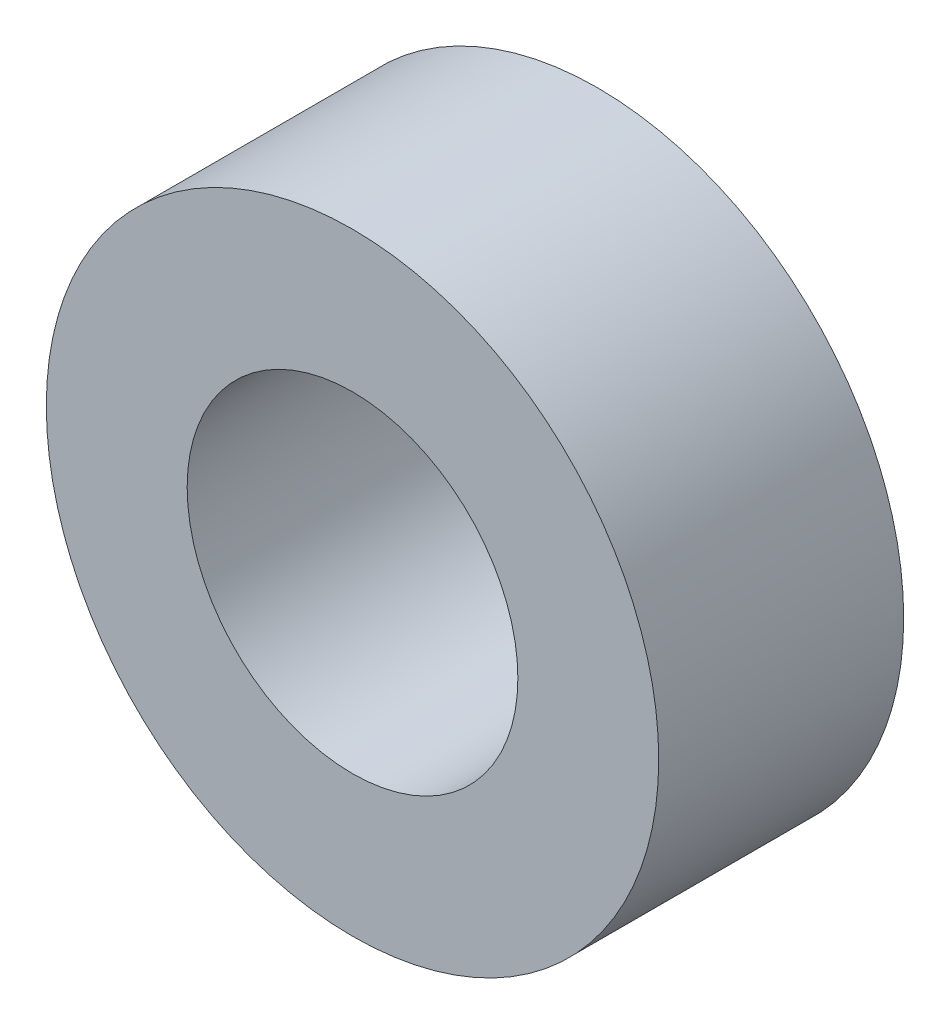
ISO-10303-21;
HEADER;
FILE_DESCRIPTION(('STEP AP214'),'2;1');
FILE_NAME('part.step','',(''),(''),'','','');
FILE_SCHEMA(('AUTOMOTIVE_DESIGN { 1 0 10303 214 1 1 1 1 }'));
ENDSEC;
DATA;
#1=APPLICATION_CONTEXT('core data for automotive mechanical design processes');
#2=APPLICATION_PROTOCOL_DEFINITION('international standard','automotive_design',2000,#1);
#3=PRODUCT_CONTEXT('',#1,'mechanical');
#4=PRODUCT('Part','Part','',(#3));
#5=PRODUCT_RELATED_PRODUCT_CATEGORY('part','',(#4));
#6=PRODUCT_DEFINITION_FORMATION('','',#4);
#7=PRODUCT_DEFINITION_CONTEXT('part definition',#1,'design');
#8=PRODUCT_DEFINITION('design','',#6,#7);
#9=PRODUCT_DEFINITION_SHAPE('','',#8);
#10=(LENGTH_UNIT() NAMED_UNIT(*) SI_UNIT(.MILLI.,.METRE.));
#11=(NAMED_UNIT(*) PLANE_ANGLE_UNIT() SI_UNIT($,.RADIAN.));
#12=(NAMED_UNIT(*) SI_UNIT($,.STERADIAN.) SOLID_ANGLE_UNIT());
#13=UNCERTAINTY_MEASURE_WITH_UNIT(LENGTH_MEASURE(1.E-05),#10,'distance_accuracy_value','');
#14=(GEOMETRIC_REPRESENTATION_CONTEXT(3) GLOBAL_UNCERTAINTY_ASSIGNED_CONTEXT((#13)) GLOBAL_UNIT_ASSIGNED_CONTEXT((#10,
#11,#12)) REPRESENTATION_CONTEXT('',''));
#15=CARTESIAN_POINT('',(0.,0.,0.));
#16=DIRECTION('',(0.,0.,1.));
#17=DIRECTION('',(1.,0.,0.));
#18=AXIS2_PLACEMENT_3D('',#15,#16,#17);
#19=CARTESIAN_POINT('',(0.,0.,2.));
#20=DIRECTION('',(0.,0.,1.));
#21=DIRECTION('',(1.,0.,0.));
#22=AXIS2_PLACEMENT_3D('',#19,#20,#21);
#23=PLANE('',#22);
#24=CARTESIAN_POINT('',(0.,0.,2.));
#25=DIRECTION('',(0.,0.,1.));
#26=DIRECTION('',(1.,0.,0.));
#27=AXIS2_PLACEMENT_3D('',#24,#25,#26);
#28=CIRCLE('',#27,2.5);
#29=CARTESIAN_POINT('',(2.5,0.,2.));
#30=VERTEX_POINT('',#29);
#31=EDGE_CURVE('E10',#30,#30,#28,.T.);
#32=ORIENTED_EDGE('',*,*,#31,.T.);
#33=EDGE_LOOP('',(#32));
#34=FACE_BOUND('',#33,.T.);
#35=CARTESIAN_POINT('',(0.,0.,2.));
#36=DIRECTION('',(0.,0.,1.));
#37=DIRECTION('',(1.,0.,0.));
#38=AXIS2_PLACEMENT_3D('',#35,#36,#37);
#39=CIRCLE('',#38,1.35);
#40=CARTESIAN_POINT('',(1.35,0.,2.));
#41=VERTEX_POINT('',#40);
#42=EDGE_CURVE('E44',#41,#41,#39,.T.);
#43=ORIENTED_EDGE('',*,*,#42,.F.);
#44=EDGE_LOOP('',(#43));
#45=FACE_BOUND('',#44,.T.);
#46=ADVANCED_FACE('F33',(#34,#45),#23,.T.);
#47=CARTESIAN_POINT('',(0.,0.,0.));
#48=DIRECTION('',(0.,0.,1.));
#49=DIRECTION('',(1.,0.,0.));
#50=AXIS2_PLACEMENT_3D('',#47,#48,#49);
#51=PLANE('',#50);
#52=CARTESIAN_POINT('',(0.,0.,0.));
#53=DIRECTION('',(0.,0.,1.));
#54=DIRECTION('',(1.,0.,0.));
#55=AXIS2_PLACEMENT_3D('',#52,#53,#54);
#56=CIRCLE('',#55,2.5);
#57=CARTESIAN_POINT('',(2.5,0.,0.));
#58=VERTEX_POINT('',#57);
#59=EDGE_CURVE('E37',#58,#58,#56,.T.);
#60=ORIENTED_EDGE('',*,*,#59,.F.);
#61=EDGE_LOOP('',(#60));
#62=FACE_BOUND('',#61,.T.);
#63=CARTESIAN_POINT('',(0.,0.,0.));
#64=DIRECTION('',(0.,0.,1.));
#65=DIRECTION('',(1.,0.,0.));
#66=AXIS2_PLACEMENT_3D('',#63,#64,#65);
#67=CIRCLE('',#66,1.35);
#68=CARTESIAN_POINT('',(1.35,0.,0.));
#69=VERTEX_POINT('',#68);
#70=EDGE_CURVE('E46',#69,#69,#67,.T.);
#71=ORIENTED_EDGE('',*,*,#70,.T.);
#72=EDGE_LOOP('',(#71));
#73=FACE_BOUND('',#72,.T.);
#74=ADVANCED_FACE('F56',(#62,#73),#51,.F.);
#75=CARTESIAN_POINT('',(0.,0.,2.));
#76=DIRECTION('',(0.,0.,-1.));
#77=DIRECTION('',(-1.,0.,0.));
#78=AXIS2_PLACEMENT_3D('',#75,#76,#77);
#79=CYLINDRICAL_SURFACE('',#78,2.5);
#80=ORIENTED_EDGE('',*,*,#31,.F.);
#81=EDGE_LOOP('',(#80));
#82=FACE_BOUND('',#81,.T.);
#83=ORIENTED_EDGE('',*,*,#59,.T.);
#84=EDGE_LOOP('',(#83));
#85=FACE_BOUND('',#84,.T.);
#86=ADVANCED_FACE('F35',(#82,#85),#79,.T.);
#87=CARTESIAN_POINT('',(0.,0.,2.));
#88=DIRECTION('',(0.,0.,-1.));
#89=DIRECTION('',(-1.,0.,0.));
#90=AXIS2_PLACEMENT_3D('',#87,#88,#89);
#91=CYLINDRICAL_SURFACE('',#90,1.35);
#92=ORIENTED_EDGE('',*,*,#42,.T.);
#93=EDGE_LOOP('',(#92));
#94=FACE_BOUND('',#93,.T.);
#95=ORIENTED_EDGE('',*,*,#70,.F.);
#96=EDGE_LOOP('',(#95));
#97=FACE_BOUND('',#96,.T.);
#98=ADVANCED_FACE('F52',(#94,#97),#91,.F.);
#99=CLOSED_SHELL('',(#46,#74,#86,#98));
#100=MANIFOLD_SOLID_BREP('B2',#99);
#101=ADVANCED_BREP_SHAPE_REPRESENTATION('',(#18,#100),#14);
#102=SHAPE_DEFINITION_REPRESENTATION(#9,#101);
ENDSEC;
END-ISO-10303-21;
